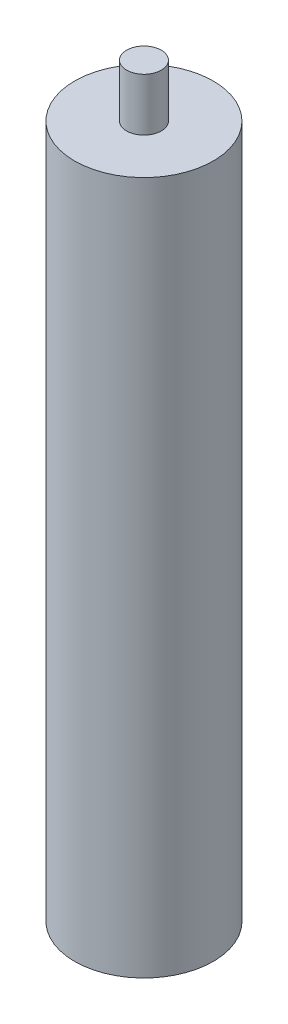
ISO-10303-21;
HEADER;
FILE_DESCRIPTION(('STEP AP214'),'2;1');
FILE_NAME('part.step','',(''),(''),'','','');
FILE_SCHEMA(('AUTOMOTIVE_DESIGN { 1 0 10303 214 1 1 1 1 }'));
ENDSEC;
DATA;
#1=APPLICATION_CONTEXT('core data for automotive mechanical design processes');
#2=APPLICATION_PROTOCOL_DEFINITION('international standard','automotive_design',2000,#1);
#3=PRODUCT_CONTEXT('',#1,'mechanical');
#4=PRODUCT('Part','Part','',(#3));
#5=PRODUCT_RELATED_PRODUCT_CATEGORY('part','',(#4));
#6=PRODUCT_DEFINITION_FORMATION('','',#4);
#7=PRODUCT_DEFINITION_CONTEXT('part definition',#1,'design');
#8=PRODUCT_DEFINITION('design','',#6,#7);
#9=PRODUCT_DEFINITION_SHAPE('','',#8);
#10=(LENGTH_UNIT() NAMED_UNIT(*) SI_UNIT(.MILLI.,.METRE.));
#11=(NAMED_UNIT(*) PLANE_ANGLE_UNIT() SI_UNIT($,.RADIAN.));
#12=(NAMED_UNIT(*) SI_UNIT($,.STERADIAN.) SOLID_ANGLE_UNIT());
#13=UNCERTAINTY_MEASURE_WITH_UNIT(LENGTH_MEASURE(1.E-05),#10,'distance_accuracy_value','');
#14=(GEOMETRIC_REPRESENTATION_CONTEXT(3) GLOBAL_UNCERTAINTY_ASSIGNED_CONTEXT((#13)) GLOBAL_UNIT_ASSIGNED_CONTEXT((#10,
#11,#12)) REPRESENTATION_CONTEXT('',''));
#15=CARTESIAN_POINT('',(0.,0.,0.));
#16=DIRECTION('',(0.,0.,1.));
#17=DIRECTION('',(1.,0.,0.));
#18=AXIS2_PLACEMENT_3D('',#15,#16,#17);
#19=CARTESIAN_POINT('',(0.,127.,0.));
#20=DIRECTION('',(0.,1.,0.));
#21=DIRECTION('',(0.,0.,1.));
#22=AXIS2_PLACEMENT_3D('',#19,#20,#21);
#23=PLANE('',#22);
#24=CARTESIAN_POINT('',(0.,127.,0.));
#25=DIRECTION('',(0.,1.,0.));
#26=DIRECTION('',(0.,0.,1.));
#27=AXIS2_PLACEMENT_3D('',#24,#25,#26);
#28=CIRCLE('',#27,12.7);
#29=CARTESIAN_POINT('',(0.,127.,12.7));
#30=VERTEX_POINT('',#29);
#31=EDGE_CURVE('E10',#30,#30,#28,.T.);
#32=ORIENTED_EDGE('',*,*,#31,.T.);
#33=EDGE_LOOP('',(#32));
#34=FACE_BOUND('',#33,.T.);
#35=CARTESIAN_POINT('',(0.,127.,0.));
#36=DIRECTION('',(0.,1.,0.));
#37=DIRECTION('',(0.,0.,1.));
#38=AXIS2_PLACEMENT_3D('',#35,#36,#37);
#39=CIRCLE('',#38,3.175);
#40=CARTESIAN_POINT('',(0.,127.,3.175));
#41=VERTEX_POINT('',#40);
#42=EDGE_CURVE('E46',#41,#41,#39,.T.);
#43=ORIENTED_EDGE('',*,*,#42,.F.);
#44=EDGE_LOOP('',(#43));
#45=FACE_BOUND('',#44,.T.);
#46=ADVANCED_FACE('F33',(#34,#45),#23,.T.);
#47=CARTESIAN_POINT('',(0.,127.,0.));
#48=DIRECTION('',(0.,-1.,0.));
#49=DIRECTION('',(0.,0.,-1.));
#50=AXIS2_PLACEMENT_3D('',#47,#48,#49);
#51=CYLINDRICAL_SURFACE('',#50,12.7);
#52=ORIENTED_EDGE('',*,*,#31,.F.);
#53=EDGE_LOOP('',(#52));
#54=FACE_BOUND('',#53,.T.);
#55=CARTESIAN_POINT('',(0.,0.,0.));
#56=DIRECTION('',(0.,1.,0.));
#57=DIRECTION('',(0.,0.,1.));
#58=AXIS2_PLACEMENT_3D('',#55,#56,#57);
#59=CIRCLE('',#58,12.7);
#60=CARTESIAN_POINT('',(0.,0.,12.7));
#61=VERTEX_POINT('',#60);
#62=EDGE_CURVE('E37',#61,#61,#59,.T.);
#63=ORIENTED_EDGE('',*,*,#62,.T.);
#64=EDGE_LOOP('',(#63));
#65=FACE_BOUND('',#64,.T.);
#66=ADVANCED_FACE('F35',(#54,#65),#51,.T.);
#67=CARTESIAN_POINT('',(0.,0.,0.));
#68=DIRECTION('',(0.,1.,0.));
#69=DIRECTION('',(0.,0.,1.));
#70=AXIS2_PLACEMENT_3D('',#67,#68,#69);
#71=PLANE('',#70);
#72=ORIENTED_EDGE('',*,*,#62,.F.);
#73=EDGE_LOOP('',(#72));
#74=FACE_BOUND('',#73,.T.);
#75=ADVANCED_FACE('F57',(#74),#71,.F.);
#76=CARTESIAN_POINT('',(0.,136.652,0.));
#77=DIRECTION('',(0.,-1.,0.));
#78=DIRECTION('',(0.,0.,-1.));
#79=AXIS2_PLACEMENT_3D('',#76,#77,#78);
#80=CYLINDRICAL_SURFACE('',#79,3.175);
#81=CARTESIAN_POINT('',(0.,136.652,0.));
#82=DIRECTION('',(0.,1.,0.));
#83=DIRECTION('',(0.,0.,1.));
#84=AXIS2_PLACEMENT_3D('',#81,#82,#83);
#85=CIRCLE('',#84,3.175);
#86=CARTESIAN_POINT('',(0.,136.652,3.175));
#87=VERTEX_POINT('',#86);
#88=EDGE_CURVE('E44',#87,#87,#85,.T.);
#89=ORIENTED_EDGE('',*,*,#88,.F.);
#90=EDGE_LOOP('',(#89));
#91=FACE_BOUND('',#90,.T.);
#92=ORIENTED_EDGE('',*,*,#42,.T.);
#93=EDGE_LOOP('',(#92));
#94=FACE_BOUND('',#93,.T.);
#95=ADVANCED_FACE('F54',(#91,#94),#80,.T.);
#96=CARTESIAN_POINT('',(0.,136.652,0.));
#97=DIRECTION('',(0.,1.,0.));
#98=DIRECTION('',(0.,0.,1.));
#99=AXIS2_PLACEMENT_3D('',#96,#97,#98);
#100=PLANE('',#99);
#101=ORIENTED_EDGE('',*,*,#88,.T.);
#102=EDGE_LOOP('',(#101));
#103=FACE_BOUND('',#102,.T.);
#104=ADVANCED_FACE('F52',(#103),#100,.T.);
#105=CLOSED_SHELL('',(#46,#66,#75,#95,#104));
#106=MANIFOLD_SOLID_BREP('B2',#105);
#107=ADVANCED_BREP_SHAPE_REPRESENTATION('',(#18,#106),#14);
#108=SHAPE_DEFINITION_REPRESENTATION(#9,#107);
ENDSEC;
END-ISO-10303-21;
